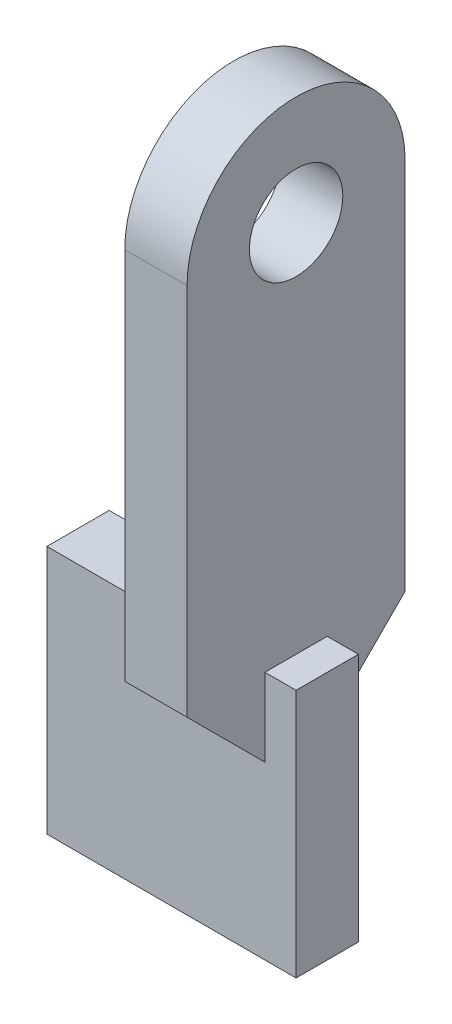
ISO-10303-21;
HEADER;
FILE_DESCRIPTION(('STEP AP214'),'2;1');
FILE_NAME('part.step','',(''),(''),'','','');
FILE_SCHEMA(('AUTOMOTIVE_DESIGN { 1 0 10303 214 1 1 1 1 }'));
ENDSEC;
DATA;
#1=APPLICATION_CONTEXT('core data for automotive mechanical design processes');
#2=APPLICATION_PROTOCOL_DEFINITION('international standard','automotive_design',2000,#1);
#3=PRODUCT_CONTEXT('',#1,'mechanical');
#4=PRODUCT('Part','Part','',(#3));
#5=PRODUCT_RELATED_PRODUCT_CATEGORY('part','',(#4));
#6=PRODUCT_DEFINITION_FORMATION('','',#4);
#7=PRODUCT_DEFINITION_CONTEXT('part definition',#1,'design');
#8=PRODUCT_DEFINITION('design','',#6,#7);
#9=PRODUCT_DEFINITION_SHAPE('','',#8);
#10=(LENGTH_UNIT() NAMED_UNIT(*) SI_UNIT(.MILLI.,.METRE.));
#11=(NAMED_UNIT(*) PLANE_ANGLE_UNIT() SI_UNIT($,.RADIAN.));
#12=(NAMED_UNIT(*) SI_UNIT($,.STERADIAN.) SOLID_ANGLE_UNIT());
#13=UNCERTAINTY_MEASURE_WITH_UNIT(LENGTH_MEASURE(1.E-05),#10,'distance_accuracy_value','');
#14=(GEOMETRIC_REPRESENTATION_CONTEXT(3) GLOBAL_UNCERTAINTY_ASSIGNED_CONTEXT((#13)) GLOBAL_UNIT_ASSIGNED_CONTEXT((#10,
#11,#12)) REPRESENTATION_CONTEXT('',''));
#15=CARTESIAN_POINT('',(0.,0.,0.));
#16=DIRECTION('',(0.,0.,1.));
#17=DIRECTION('',(1.,0.,0.));
#18=AXIS2_PLACEMENT_3D('',#15,#16,#17);
#19=CARTESIAN_POINT('',(0.,0.,-1.));
#20=DIRECTION('',(0.,0.,1.));
#21=DIRECTION('',(1.,0.,0.));
#22=AXIS2_PLACEMENT_3D('',#19,#20,#21);
#23=PLANE('',#22);
#24=DIRECTION('',(0.,-1.,0.));
#25=VECTOR('',#24,1.);
#26=CARTESIAN_POINT('',(1.,-14.5,-1.));
#27=LINE('',#26,#25);
#28=CARTESIAN_POINT('',(1.,-12.,-1.));
#29=VERTEX_POINT('',#28);
#30=CARTESIAN_POINT('',(1.,-14.5,-1.));
#31=VERTEX_POINT('',#30);
#32=EDGE_CURVE('E130',#29,#31,#27,.T.);
#33=ORIENTED_EDGE('',*,*,#32,.F.);
#34=DIRECTION('',(-1.,0.,0.));
#35=VECTOR('',#34,1.);
#36=CARTESIAN_POINT('',(-6.,-12.,-1.));
#37=LINE('',#36,#35);
#38=CARTESIAN_POINT('',(2.,-12.,-1.));
#39=VERTEX_POINT('',#38);
#40=EDGE_CURVE('E164',#39,#29,#37,.T.);
#41=ORIENTED_EDGE('',*,*,#40,.F.);
#42=DIRECTION('',(0.,1.,0.));
#43=VECTOR('',#42,1.);
#44=CARTESIAN_POINT('',(2.,-12.,-1.));
#45=LINE('',#44,#43);
#46=CARTESIAN_POINT('',(2.,-20.,-1.));
#47=VERTEX_POINT('',#46);
#48=EDGE_CURVE('E176',#47,#39,#45,.T.);
#49=ORIENTED_EDGE('',*,*,#48,.F.);
#50=DIRECTION('',(1.,0.,0.));
#51=VECTOR('',#50,1.);
#52=CARTESIAN_POINT('',(-6.,-20.,-1.));
#53=LINE('',#52,#51);
#54=CARTESIAN_POINT('',(-6.,-20.,-1.));
#55=VERTEX_POINT('',#54);
#56=EDGE_CURVE('E174',#55,#47,#53,.T.);
#57=ORIENTED_EDGE('',*,*,#56,.F.);
#58=DIRECTION('',(0.,-1.,0.));
#59=VECTOR('',#58,1.);
#60=CARTESIAN_POINT('',(-6.,-12.,-1.));
#61=LINE('',#60,#59);
#62=CARTESIAN_POINT('',(-6.,-12.,-1.));
#63=VERTEX_POINT('',#62);
#64=EDGE_CURVE('E159',#63,#55,#61,.T.);
#65=ORIENTED_EDGE('',*,*,#64,.F.);
#66=CARTESIAN_POINT('',(-1.,-12.,-1.));
#67=VERTEX_POINT('',#66);
#68=EDGE_CURVE('E178',#67,#63,#37,.T.);
#69=ORIENTED_EDGE('',*,*,#68,.F.);
#70=DIRECTION('',(0.,-1.,0.));
#71=VECTOR('',#70,1.);
#72=CARTESIAN_POINT('',(-1.,-14.5,-1.));
#73=LINE('',#72,#71);
#74=CARTESIAN_POINT('',(-1.,-14.5,-1.));
#75=VERTEX_POINT('',#74);
#76=EDGE_CURVE('E144',#67,#75,#73,.T.);
#77=ORIENTED_EDGE('',*,*,#76,.T.);
#78=DIRECTION('',(-1.,0.,0.));
#79=VECTOR('',#78,1.);
#80=CARTESIAN_POINT('',(1.,-14.5,-1.));
#81=LINE('',#80,#79);
#82=EDGE_CURVE('E50',#31,#75,#81,.T.);
#83=ORIENTED_EDGE('',*,*,#82,.F.);
#84=EDGE_LOOP('',(#33,#41,#49,#57,#65,#69,#77,#83));
#85=FACE_BOUND('',#84,.T.);
#86=ADVANCED_FACE('F35',(#85),#23,.F.);
#87=CARTESIAN_POINT('',(0.,0.,1.));
#88=DIRECTION('',(0.,0.,1.));
#89=DIRECTION('',(1.,0.,0.));
#90=AXIS2_PLACEMENT_3D('',#87,#88,#89);
#91=PLANE('',#90);
#92=DIRECTION('',(-1.,0.,0.));
#93=VECTOR('',#92,1.);
#94=CARTESIAN_POINT('',(-6.,-12.,1.));
#95=LINE('',#94,#93);
#96=CARTESIAN_POINT('',(2.,-12.,1.));
#97=VERTEX_POINT('',#96);
#98=CARTESIAN_POINT('',(1.,-12.,1.));
#99=VERTEX_POINT('',#98);
#100=EDGE_CURVE('E169',#97,#99,#95,.T.);
#101=ORIENTED_EDGE('',*,*,#100,.T.);
#102=DIRECTION('',(0.,1.,0.));
#103=VECTOR('',#102,1.);
#104=CARTESIAN_POINT('',(1.,-14.5,1.));
#105=LINE('',#104,#103);
#106=CARTESIAN_POINT('',(1.,-14.5,1.));
#107=VERTEX_POINT('',#106);
#108=EDGE_CURVE('E58',#107,#99,#105,.T.);
#109=ORIENTED_EDGE('',*,*,#108,.F.);
#110=DIRECTION('',(-1.,0.,0.));
#111=VECTOR('',#110,1.);
#112=CARTESIAN_POINT('',(1.,-14.5,1.));
#113=LINE('',#112,#111);
#114=CARTESIAN_POINT('',(-1.,-14.5,1.));
#115=VERTEX_POINT('',#114);
#116=EDGE_CURVE('E155',#107,#115,#113,.T.);
#117=ORIENTED_EDGE('',*,*,#116,.T.);
#118=DIRECTION('',(0.,1.,0.));
#119=VECTOR('',#118,1.);
#120=CARTESIAN_POINT('',(-1.,-14.5,1.));
#121=LINE('',#120,#119);
#122=CARTESIAN_POINT('',(-1.,-12.,1.));
#123=VERTEX_POINT('',#122);
#124=EDGE_CURVE('E148',#115,#123,#121,.T.);
#125=ORIENTED_EDGE('',*,*,#124,.T.);
#126=CARTESIAN_POINT('',(-6.,-12.,1.));
#127=VERTEX_POINT('',#126);
#128=EDGE_CURVE('E168',#123,#127,#95,.T.);
#129=ORIENTED_EDGE('',*,*,#128,.T.);
#130=DIRECTION('',(0.,-1.,0.));
#131=VECTOR('',#130,1.);
#132=CARTESIAN_POINT('',(-6.,-12.,1.));
#133=LINE('',#132,#131);
#134=CARTESIAN_POINT('',(-6.,-20.,1.));
#135=VERTEX_POINT('',#134);
#136=EDGE_CURVE('E160',#127,#135,#133,.T.);
#137=ORIENTED_EDGE('',*,*,#136,.T.);
#138=DIRECTION('',(1.,0.,0.));
#139=VECTOR('',#138,1.);
#140=CARTESIAN_POINT('',(-6.,-20.,1.));
#141=LINE('',#140,#139);
#142=CARTESIAN_POINT('',(2.,-20.,1.));
#143=VERTEX_POINT('',#142);
#144=EDGE_CURVE('E163',#135,#143,#141,.T.);
#145=ORIENTED_EDGE('',*,*,#144,.T.);
#146=DIRECTION('',(0.,1.,0.));
#147=VECTOR('',#146,1.);
#148=CARTESIAN_POINT('',(2.,-12.,1.));
#149=LINE('',#148,#147);
#150=EDGE_CURVE('E166',#143,#97,#149,.T.);
#151=ORIENTED_EDGE('',*,*,#150,.T.);
#152=EDGE_LOOP('',(#101,#109,#117,#125,#129,#137,#145,#151));
#153=FACE_BOUND('',#152,.T.);
#154=ADVANCED_FACE('F234',(#153),#91,.T.);
#155=CARTESIAN_POINT('',(1.,0.,0.));
#156=DIRECTION('',(1.,0.,0.));
#157=DIRECTION('',(0.,0.,-1.));
#158=AXIS2_PLACEMENT_3D('',#155,#156,#157);
#159=PLANE('',#158);
#160=CARTESIAN_POINT('',(1.,0.,0.));
#161=DIRECTION('',(1.,0.,0.));
#162=DIRECTION('',(0.,0.,-1.));
#163=AXIS2_PLACEMENT_3D('',#160,#161,#162);
#164=CIRCLE('',#163,3.5);
#165=CARTESIAN_POINT('',(1.,0.,-3.5));
#166=VERTEX_POINT('',#165);
#167=CARTESIAN_POINT('',(1.,0.,3.5));
#168=VERTEX_POINT('',#167);
#169=EDGE_CURVE('E198',#166,#168,#164,.T.);
#170=ORIENTED_EDGE('',*,*,#169,.T.);
#171=DIRECTION('',(0.,-1.,0.));
#172=VECTOR('',#171,1.);
#173=CARTESIAN_POINT('',(1.,0.,3.5));
#174=LINE('',#173,#172);
#175=CARTESIAN_POINT('',(1.,-12.,3.5));
#176=VERTEX_POINT('',#175);
#177=EDGE_CURVE('E200',#168,#176,#174,.T.);
#178=ORIENTED_EDGE('',*,*,#177,.T.);
#179=DIRECTION('',(0.,-0.707106781186549,-0.707106781186546));
#180=VECTOR('',#179,1.);
#181=CARTESIAN_POINT('',(1.,-12.,3.5));
#182=LINE('',#181,#180);
#183=EDGE_CURVE('E153',#176,#107,#182,.T.);
#184=ORIENTED_EDGE('',*,*,#183,.T.);
#185=ORIENTED_EDGE('',*,*,#108,.T.);
#186=DIRECTION('',(0.,0.,-1.));
#187=VECTOR('',#186,1.);
#188=CARTESIAN_POINT('',(1.,-12.,3.5));
#189=LINE('',#188,#187);
#190=EDGE_CURVE('E136',#99,#29,#189,.T.);
#191=ORIENTED_EDGE('',*,*,#190,.T.);
#192=ORIENTED_EDGE('',*,*,#32,.T.);
#193=DIRECTION('',(0.,0.707106781186549,-0.707106781186546));
#194=VECTOR('',#193,1.);
#195=CARTESIAN_POINT('',(1.,-12.,-3.5));
#196=LINE('',#195,#194);
#197=CARTESIAN_POINT('',(1.,-12.,-3.5));
#198=VERTEX_POINT('',#197);
#199=EDGE_CURVE('E123',#31,#198,#196,.T.);
#200=ORIENTED_EDGE('',*,*,#199,.T.);
#201=DIRECTION('',(0.,1.,0.));
#202=VECTOR('',#201,1.);
#203=CARTESIAN_POINT('',(1.,-12.,-3.5));
#204=LINE('',#203,#202);
#205=EDGE_CURVE('E204',#198,#166,#204,.T.);
#206=ORIENTED_EDGE('',*,*,#205,.T.);
#207=EDGE_LOOP('',(#170,#178,#184,#185,#191,#192,#200,#206));
#208=FACE_BOUND('',#207,.T.);
#209=CARTESIAN_POINT('',(1.,0.,0.));
#210=DIRECTION('',(1.,0.,0.));
#211=DIRECTION('',(0.,0.,-1.));
#212=AXIS2_PLACEMENT_3D('',#209,#210,#211);
#213=CIRCLE('',#212,1.5);
#214=CARTESIAN_POINT('',(1.,0.,-1.5));
#215=VERTEX_POINT('',#214);
#216=EDGE_CURVE('E192',#215,#215,#213,.T.);
#217=ORIENTED_EDGE('',*,*,#216,.F.);
#218=EDGE_LOOP('',(#217));
#219=FACE_BOUND('',#218,.T.);
#220=ADVANCED_FACE('F134',(#208,#219),#159,.T.);
#221=CARTESIAN_POINT('',(-1.,0.,0.));
#222=DIRECTION('',(1.,0.,0.));
#223=DIRECTION('',(0.,0.,-1.));
#224=AXIS2_PLACEMENT_3D('',#221,#222,#223);
#225=PLANE('',#224);
#226=CARTESIAN_POINT('',(-1.,0.,0.));
#227=DIRECTION('',(1.,0.,0.));
#228=DIRECTION('',(0.,0.,-1.));
#229=AXIS2_PLACEMENT_3D('',#226,#227,#228);
#230=CIRCLE('',#229,3.5);
#231=CARTESIAN_POINT('',(-1.,0.,-3.5));
#232=VERTEX_POINT('',#231);
#233=CARTESIAN_POINT('',(-1.,0.,3.5));
#234=VERTEX_POINT('',#233);
#235=EDGE_CURVE('E195',#232,#234,#230,.T.);
#236=ORIENTED_EDGE('',*,*,#235,.F.);
#237=DIRECTION('',(0.,1.,0.));
#238=VECTOR('',#237,1.);
#239=CARTESIAN_POINT('',(-1.,-12.,-3.5));
#240=LINE('',#239,#238);
#241=CARTESIAN_POINT('',(-1.,-12.,-3.5));
#242=VERTEX_POINT('',#241);
#243=EDGE_CURVE('E201',#242,#232,#240,.T.);
#244=ORIENTED_EDGE('',*,*,#243,.F.);
#245=DIRECTION('',(0.,0.707106781186549,-0.707106781186546));
#246=VECTOR('',#245,1.);
#247=CARTESIAN_POINT('',(-1.,-12.,-3.5));
#248=LINE('',#247,#246);
#249=EDGE_CURVE('E140',#75,#242,#248,.T.);
#250=ORIENTED_EDGE('',*,*,#249,.F.);
#251=ORIENTED_EDGE('',*,*,#76,.F.);
#252=DIRECTION('',(0.,0.,-1.));
#253=VECTOR('',#252,1.);
#254=CARTESIAN_POINT('',(-1.,-12.,3.5));
#255=LINE('',#254,#253);
#256=EDGE_CURVE('E211',#123,#67,#255,.T.);
#257=ORIENTED_EDGE('',*,*,#256,.F.);
#258=ORIENTED_EDGE('',*,*,#124,.F.);
#259=DIRECTION('',(0.,-0.707106781186549,-0.707106781186546));
#260=VECTOR('',#259,1.);
#261=CARTESIAN_POINT('',(-1.,-12.,3.5));
#262=LINE('',#261,#260);
#263=CARTESIAN_POINT('',(-1.,-12.,3.5));
#264=VERTEX_POINT('',#263);
#265=EDGE_CURVE('E145',#264,#115,#262,.T.);
#266=ORIENTED_EDGE('',*,*,#265,.F.);
#267=DIRECTION('',(0.,-1.,0.));
#268=VECTOR('',#267,1.);
#269=CARTESIAN_POINT('',(-1.,0.,3.5));
#270=LINE('',#269,#268);
#271=EDGE_CURVE('E209',#234,#264,#270,.T.);
#272=ORIENTED_EDGE('',*,*,#271,.F.);
#273=EDGE_LOOP('',(#236,#244,#250,#251,#257,#258,#266,#272));
#274=FACE_BOUND('',#273,.T.);
#275=CARTESIAN_POINT('',(-1.,0.,0.));
#276=DIRECTION('',(1.,0.,0.));
#277=DIRECTION('',(0.,0.,-1.));
#278=AXIS2_PLACEMENT_3D('',#275,#276,#277);
#279=CIRCLE('',#278,1.5);
#280=CARTESIAN_POINT('',(-1.,0.,-1.5));
#281=VERTEX_POINT('',#280);
#282=EDGE_CURVE('E191',#281,#281,#279,.T.);
#283=ORIENTED_EDGE('',*,*,#282,.T.);
#284=EDGE_LOOP('',(#283));
#285=FACE_BOUND('',#284,.T.);
#286=ADVANCED_FACE('F230',(#274,#285),#225,.F.);
#287=CARTESIAN_POINT('',(1.,0.,0.));
#288=DIRECTION('',(-1.,0.,0.));
#289=DIRECTION('',(0.,0.,1.));
#290=AXIS2_PLACEMENT_3D('',#287,#288,#289);
#291=CYLINDRICAL_SURFACE('',#290,3.5);
#292=ORIENTED_EDGE('',*,*,#235,.T.);
#293=DIRECTION('',(-1.,0.,0.));
#294=VECTOR('',#293,1.);
#295=CARTESIAN_POINT('',(1.,0.,3.5));
#296=LINE('',#295,#294);
#297=EDGE_CURVE('E11',#168,#234,#296,.T.);
#298=ORIENTED_EDGE('',*,*,#297,.F.);
#299=ORIENTED_EDGE('',*,*,#169,.F.);
#300=DIRECTION('',(-1.,0.,0.));
#301=VECTOR('',#300,1.);
#302=CARTESIAN_POINT('',(1.,0.,-3.5));
#303=LINE('',#302,#301);
#304=EDGE_CURVE('E206',#166,#232,#303,.T.);
#305=ORIENTED_EDGE('',*,*,#304,.T.);
#306=EDGE_LOOP('',(#292,#298,#299,#305));
#307=FACE_BOUND('',#306,.T.);
#308=ADVANCED_FACE('F37',(#307),#291,.T.);
#309=CARTESIAN_POINT('',(1.,0.,3.5));
#310=DIRECTION('',(0.,0.,-1.));
#311=DIRECTION('',(-1.,0.,0.));
#312=AXIS2_PLACEMENT_3D('',#309,#310,#311);
#313=PLANE('',#312);
#314=ORIENTED_EDGE('',*,*,#271,.T.);
#315=DIRECTION('',(-1.,0.,0.));
#316=VECTOR('',#315,1.);
#317=CARTESIAN_POINT('',(1.,-12.,3.5));
#318=LINE('',#317,#316);
#319=EDGE_CURVE('E43',#176,#264,#318,.T.);
#320=ORIENTED_EDGE('',*,*,#319,.F.);
#321=ORIENTED_EDGE('',*,*,#177,.F.);
#322=ORIENTED_EDGE('',*,*,#297,.T.);
#323=EDGE_LOOP('',(#314,#320,#321,#322));
#324=FACE_BOUND('',#323,.T.);
#325=ADVANCED_FACE('F226',(#324),#313,.F.);
#326=CARTESIAN_POINT('',(1.,-12.,-3.5));
#327=DIRECTION('',(0.,0.,1.));
#328=DIRECTION('',(0.,-1.,0.));
#329=AXIS2_PLACEMENT_3D('',#326,#327,#328);
#330=PLANE('',#329);
#331=ORIENTED_EDGE('',*,*,#243,.T.);
#332=ORIENTED_EDGE('',*,*,#304,.F.);
#333=ORIENTED_EDGE('',*,*,#205,.F.);
#334=DIRECTION('',(-1.,0.,0.));
#335=VECTOR('',#334,1.);
#336=CARTESIAN_POINT('',(1.,-12.,-3.5));
#337=LINE('',#336,#335);
#338=EDGE_CURVE('E127',#198,#242,#337,.T.);
#339=ORIENTED_EDGE('',*,*,#338,.T.);
#340=EDGE_LOOP('',(#331,#332,#333,#339));
#341=FACE_BOUND('',#340,.T.);
#342=ADVANCED_FACE('F300',(#341),#330,.F.);
#343=CARTESIAN_POINT('',(1.,0.,0.));
#344=DIRECTION('',(-1.,0.,0.));
#345=DIRECTION('',(0.,0.,1.));
#346=AXIS2_PLACEMENT_3D('',#343,#344,#345);
#347=CYLINDRICAL_SURFACE('',#346,1.5);
#348=ORIENTED_EDGE('',*,*,#216,.T.);
#349=EDGE_LOOP('',(#348));
#350=FACE_BOUND('',#349,.T.);
#351=ORIENTED_EDGE('',*,*,#282,.F.);
#352=EDGE_LOOP('',(#351));
#353=FACE_BOUND('',#352,.T.);
#354=ADVANCED_FACE('F264',(#350,#353),#347,.F.);
#355=CARTESIAN_POINT('',(-6.,-12.,1.));
#356=DIRECTION('',(0.,-1.,0.));
#357=DIRECTION('',(1.,0.,0.));
#358=AXIS2_PLACEMENT_3D('',#355,#356,#357);
#359=PLANE('',#358);
#360=ORIENTED_EDGE('',*,*,#128,.F.);
#361=ORIENTED_EDGE('',*,*,#256,.T.);
#362=ORIENTED_EDGE('',*,*,#68,.T.);
#363=DIRECTION('',(0.,0.,-1.));
#364=VECTOR('',#363,1.);
#365=CARTESIAN_POINT('',(-6.,-12.,1.));
#366=LINE('',#365,#364);
#367=EDGE_CURVE('E171',#127,#63,#366,.T.);
#368=ORIENTED_EDGE('',*,*,#367,.F.);
#369=EDGE_LOOP('',(#360,#361,#362,#368));
#370=FACE_BOUND('',#369,.T.);
#371=ADVANCED_FACE('F239',(#370),#359,.F.);
#372=CARTESIAN_POINT('',(-6.,-12.,1.));
#373=DIRECTION('',(1.,0.,0.));
#374=DIRECTION('',(0.,1.,0.));
#375=AXIS2_PLACEMENT_3D('',#372,#373,#374);
#376=PLANE('',#375);
#377=ORIENTED_EDGE('',*,*,#64,.T.);
#378=DIRECTION('',(0.,0.,-1.));
#379=VECTOR('',#378,1.);
#380=CARTESIAN_POINT('',(-6.,-20.,1.));
#381=LINE('',#380,#379);
#382=EDGE_CURVE('E188',#135,#55,#381,.T.);
#383=ORIENTED_EDGE('',*,*,#382,.F.);
#384=ORIENTED_EDGE('',*,*,#136,.F.);
#385=ORIENTED_EDGE('',*,*,#367,.T.);
#386=EDGE_LOOP('',(#377,#383,#384,#385));
#387=FACE_BOUND('',#386,.T.);
#388=ADVANCED_FACE('F242',(#387),#376,.F.);
#389=CARTESIAN_POINT('',(-6.,-20.,1.));
#390=DIRECTION('',(0.,1.,0.));
#391=DIRECTION('',(0.,0.,1.));
#392=AXIS2_PLACEMENT_3D('',#389,#390,#391);
#393=PLANE('',#392);
#394=ORIENTED_EDGE('',*,*,#56,.T.);
#395=DIRECTION('',(0.,0.,-1.));
#396=VECTOR('',#395,1.);
#397=CARTESIAN_POINT('',(2.,-20.,1.));
#398=LINE('',#397,#396);
#399=EDGE_CURVE('E185',#143,#47,#398,.T.);
#400=ORIENTED_EDGE('',*,*,#399,.F.);
#401=ORIENTED_EDGE('',*,*,#144,.F.);
#402=ORIENTED_EDGE('',*,*,#382,.T.);
#403=EDGE_LOOP('',(#394,#400,#401,#402));
#404=FACE_BOUND('',#403,.T.);
#405=ADVANCED_FACE('F244',(#404),#393,.F.);
#406=CARTESIAN_POINT('',(2.,-12.,1.));
#407=DIRECTION('',(-1.,0.,0.));
#408=DIRECTION('',(0.,-1.,0.));
#409=AXIS2_PLACEMENT_3D('',#406,#407,#408);
#410=PLANE('',#409);
#411=ORIENTED_EDGE('',*,*,#48,.T.);
#412=DIRECTION('',(0.,0.,-1.));
#413=VECTOR('',#412,1.);
#414=CARTESIAN_POINT('',(2.,-12.,1.));
#415=LINE('',#414,#413);
#416=EDGE_CURVE('E182',#97,#39,#415,.T.);
#417=ORIENTED_EDGE('',*,*,#416,.F.);
#418=ORIENTED_EDGE('',*,*,#150,.F.);
#419=ORIENTED_EDGE('',*,*,#399,.T.);
#420=EDGE_LOOP('',(#411,#417,#418,#419));
#421=FACE_BOUND('',#420,.T.);
#422=ADVANCED_FACE('F250',(#421),#410,.F.);
#423=ORIENTED_EDGE('',*,*,#190,.F.);
#424=ORIENTED_EDGE('',*,*,#100,.F.);
#425=ORIENTED_EDGE('',*,*,#416,.T.);
#426=ORIENTED_EDGE('',*,*,#40,.T.);
#427=EDGE_LOOP('',(#423,#424,#425,#426));
#428=FACE_BOUND('',#427,.T.);
#429=ADVANCED_FACE('F253',(#428),#359,.F.);
#430=CARTESIAN_POINT('',(1.,-12.,3.5));
#431=DIRECTION('',(0.,0.707106781186546,-0.707106781186549));
#432=DIRECTION('',(0.,0.707106781186549,0.707106781186546));
#433=AXIS2_PLACEMENT_3D('',#430,#431,#432);
#434=PLANE('',#433);
#435=ORIENTED_EDGE('',*,*,#265,.T.);
#436=ORIENTED_EDGE('',*,*,#116,.F.);
#437=ORIENTED_EDGE('',*,*,#183,.F.);
#438=ORIENTED_EDGE('',*,*,#319,.T.);
#439=EDGE_LOOP('',(#435,#436,#437,#438));
#440=FACE_BOUND('',#439,.T.);
#441=ADVANCED_FACE('F221',(#440),#434,.F.);
#442=CARTESIAN_POINT('',(1.,-12.,-3.5));
#443=DIRECTION('',(0.,0.707106781186546,0.707106781186549));
#444=DIRECTION('',(0.,-0.707106781186549,0.707106781186546));
#445=AXIS2_PLACEMENT_3D('',#442,#443,#444);
#446=PLANE('',#445);
#447=ORIENTED_EDGE('',*,*,#249,.T.);
#448=ORIENTED_EDGE('',*,*,#338,.F.);
#449=ORIENTED_EDGE('',*,*,#199,.F.);
#450=ORIENTED_EDGE('',*,*,#82,.T.);
#451=EDGE_LOOP('',(#447,#448,#449,#450));
#452=FACE_BOUND('',#451,.T.);
#453=ADVANCED_FACE('F125',(#452),#446,.F.);
#454=CLOSED_SHELL('',(#86,#154,#220,#286,#308,#325,#342,#354,#371,#388,#405,#422,#429,#441,#453));
#455=MANIFOLD_SOLID_BREP('B2',#454);
#456=ADVANCED_BREP_SHAPE_REPRESENTATION('',(#18,#455),#14);
#457=SHAPE_DEFINITION_REPRESENTATION(#9,#456);
ENDSEC;
END-ISO-10303-21;
